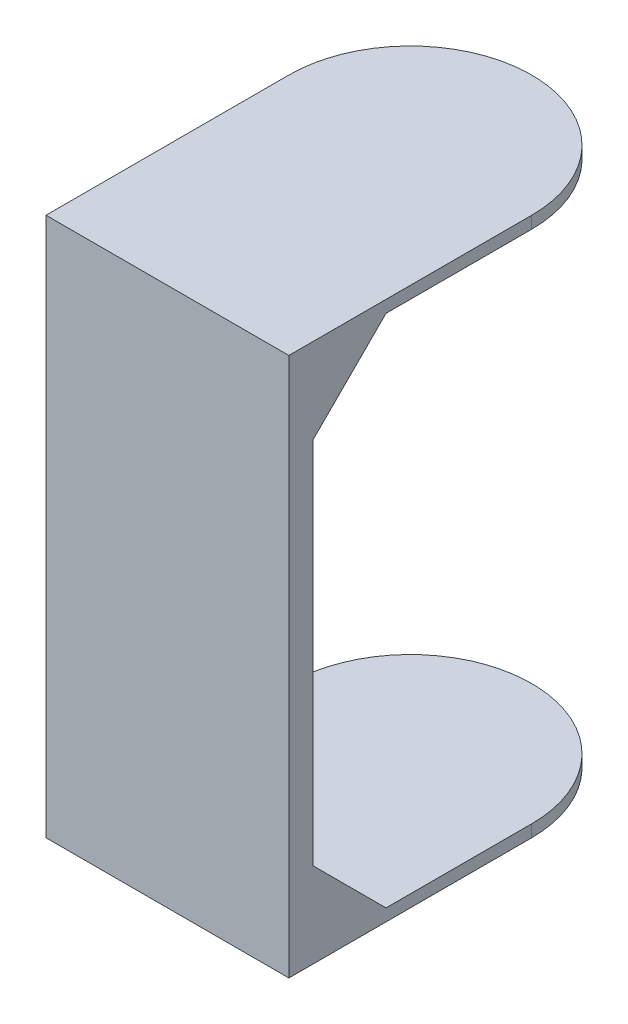
ISO-10303-21;
HEADER;
FILE_DESCRIPTION(('STEP AP214'),'2;1');
FILE_NAME('part.step','',(''),(''),'','','');
FILE_SCHEMA(('AUTOMOTIVE_DESIGN { 1 0 10303 214 1 1 1 1 }'));
ENDSEC;
DATA;
#1=APPLICATION_CONTEXT('core data for automotive mechanical design processes');
#2=APPLICATION_PROTOCOL_DEFINITION('international standard','automotive_design',2000,#1);
#3=PRODUCT_CONTEXT('',#1,'mechanical');
#4=PRODUCT('Part','Part','',(#3));
#5=PRODUCT_RELATED_PRODUCT_CATEGORY('part','',(#4));
#6=PRODUCT_DEFINITION_FORMATION('','',#4);
#7=PRODUCT_DEFINITION_CONTEXT('part definition',#1,'design');
#8=PRODUCT_DEFINITION('design','',#6,#7);
#9=PRODUCT_DEFINITION_SHAPE('','',#8);
#10=(LENGTH_UNIT() NAMED_UNIT(*) SI_UNIT(.MILLI.,.METRE.));
#11=(NAMED_UNIT(*) PLANE_ANGLE_UNIT() SI_UNIT($,.RADIAN.));
#12=(NAMED_UNIT(*) SI_UNIT($,.STERADIAN.) SOLID_ANGLE_UNIT());
#13=UNCERTAINTY_MEASURE_WITH_UNIT(LENGTH_MEASURE(1.E-05),#10,'distance_accuracy_value','');
#14=(GEOMETRIC_REPRESENTATION_CONTEXT(3) GLOBAL_UNCERTAINTY_ASSIGNED_CONTEXT((#13)) GLOBAL_UNIT_ASSIGNED_CONTEXT((#10,
#11,#12)) REPRESENTATION_CONTEXT('',''));
#15=CARTESIAN_POINT('',(0.,0.,0.));
#16=DIRECTION('',(0.,0.,1.));
#17=DIRECTION('',(1.,0.,0.));
#18=AXIS2_PLACEMENT_3D('',#15,#16,#17);
#19=CARTESIAN_POINT('',(0.,0.,-10.));
#20=DIRECTION('',(0.,0.,1.));
#21=DIRECTION('',(1.,0.,0.));
#22=AXIS2_PLACEMENT_3D('',#19,#20,#21);
#23=PLANE('',#22);
#24=DIRECTION('',(0.,1.,0.));
#25=VECTOR('',#24,1.);
#26=CARTESIAN_POINT('',(-40.,-106.,-10.));
#27=LINE('',#26,#25);
#28=CARTESIAN_POINT('',(-40.,-106.,-10.));
#29=VERTEX_POINT('',#28);
#30=CARTESIAN_POINT('',(-40.,-76.,-10.));
#31=VERTEX_POINT('',#30);
#32=EDGE_CURVE('E195',#29,#31,#27,.T.);
#33=ORIENTED_EDGE('',*,*,#32,.T.);
#34=DIRECTION('',(-1.,0.,0.));
#35=VECTOR('',#34,1.);
#36=CARTESIAN_POINT('',(-40.,-76.,-10.));
#37=LINE('',#36,#35);
#38=CARTESIAN_POINT('',(-50.,-76.,-10.));
#39=VERTEX_POINT('',#38);
#40=EDGE_CURVE('E203',#31,#39,#37,.T.);
#41=ORIENTED_EDGE('',*,*,#40,.T.);
#42=DIRECTION('',(0.,-1.,0.));
#43=VECTOR('',#42,1.);
#44=CARTESIAN_POINT('',(-50.,106.,-10.));
#45=LINE('',#44,#43);
#46=CARTESIAN_POINT('',(-50.,106.,-10.));
#47=VERTEX_POINT('',#46);
#48=EDGE_CURVE('E41',#47,#39,#45,.T.);
#49=ORIENTED_EDGE('',*,*,#48,.F.);
#50=DIRECTION('',(-1.,0.,0.));
#51=VECTOR('',#50,1.);
#52=CARTESIAN_POINT('',(-50.,106.,-10.));
#53=LINE('',#52,#51);
#54=CARTESIAN_POINT('',(40.,106.,-10.));
#55=VERTEX_POINT('',#54);
#56=EDGE_CURVE('E239',#55,#47,#53,.T.);
#57=ORIENTED_EDGE('',*,*,#56,.F.);
#58=DIRECTION('',(0.,-1.,0.));
#59=VECTOR('',#58,1.);
#60=CARTESIAN_POINT('',(40.,106.,-10.));
#61=LINE('',#60,#59);
#62=CARTESIAN_POINT('',(40.,76.,-10.));
#63=VERTEX_POINT('',#62);
#64=EDGE_CURVE('E226',#55,#63,#61,.T.);
#65=ORIENTED_EDGE('',*,*,#64,.T.);
#66=DIRECTION('',(1.,0.,0.));
#67=VECTOR('',#66,1.);
#68=CARTESIAN_POINT('',(40.,76.,-10.));
#69=LINE('',#68,#67);
#70=CARTESIAN_POINT('',(50.,76.,-10.));
#71=VERTEX_POINT('',#70);
#72=EDGE_CURVE('E232',#63,#71,#69,.T.);
#73=ORIENTED_EDGE('',*,*,#72,.T.);
#74=DIRECTION('',(0.,1.,0.));
#75=VECTOR('',#74,1.);
#76=CARTESIAN_POINT('',(50.,106.,-10.));
#77=LINE('',#76,#75);
#78=CARTESIAN_POINT('',(50.,-76.,-10.));
#79=VERTEX_POINT('',#78);
#80=EDGE_CURVE('E54',#79,#71,#77,.T.);
#81=ORIENTED_EDGE('',*,*,#80,.F.);
#82=DIRECTION('',(1.,0.,0.));
#83=VECTOR('',#82,1.);
#84=CARTESIAN_POINT('',(40.,-76.,-10.));
#85=LINE('',#84,#83);
#86=CARTESIAN_POINT('',(40.,-76.,-10.));
#87=VERTEX_POINT('',#86);
#88=EDGE_CURVE('E218',#87,#79,#85,.T.);
#89=ORIENTED_EDGE('',*,*,#88,.F.);
#90=DIRECTION('',(0.,1.,0.));
#91=VECTOR('',#90,1.);
#92=CARTESIAN_POINT('',(40.,-106.,-10.));
#93=LINE('',#92,#91);
#94=CARTESIAN_POINT('',(40.,-106.,-10.));
#95=VERTEX_POINT('',#94);
#96=EDGE_CURVE('E214',#95,#87,#93,.T.);
#97=ORIENTED_EDGE('',*,*,#96,.F.);
#98=DIRECTION('',(1.,0.,0.));
#99=VECTOR('',#98,1.);
#100=CARTESIAN_POINT('',(-50.,-106.,-10.));
#101=LINE('',#100,#99);
#102=EDGE_CURVE('E11',#29,#95,#101,.T.);
#103=ORIENTED_EDGE('',*,*,#102,.F.);
#104=EDGE_LOOP('',(#33,#41,#49,#57,#65,#73,#81,#89,#97,#103));
#105=FACE_BOUND('',#104,.T.);
#106=ADVANCED_FACE('F32',(#105),#23,.F.);
#107=CARTESIAN_POINT('',(50.,106.,-10.));
#108=DIRECTION('',(1.,0.,0.));
#109=DIRECTION('',(0.,1.,0.));
#110=AXIS2_PLACEMENT_3D('',#107,#108,#109);
#111=PLANE('',#110);
#112=DIRECTION('',(0.,1.,0.));
#113=VECTOR('',#112,1.);
#114=CARTESIAN_POINT('',(50.,106.,0.));
#115=LINE('',#114,#113);
#116=CARTESIAN_POINT('',(50.,-111.,0.));
#117=VERTEX_POINT('',#116);
#118=CARTESIAN_POINT('',(50.,111.,0.));
#119=VERTEX_POINT('',#118);
#120=EDGE_CURVE('E158',#117,#119,#115,.T.);
#121=ORIENTED_EDGE('',*,*,#120,.F.);
#122=DIRECTION('',(0.,0.,-1.));
#123=VECTOR('',#122,1.);
#124=CARTESIAN_POINT('',(50.,-111.,0.));
#125=LINE('',#124,#123);
#126=CARTESIAN_POINT('',(50.,-111.,-100.));
#127=VERTEX_POINT('',#126);
#128=EDGE_CURVE('E151',#117,#127,#125,.T.);
#129=ORIENTED_EDGE('',*,*,#128,.T.);
#130=DIRECTION('',(0.,1.,0.));
#131=VECTOR('',#130,1.);
#132=CARTESIAN_POINT('',(50.,-111.,-100.));
#133=LINE('',#132,#131);
#134=CARTESIAN_POINT('',(50.,-106.,-100.));
#135=VERTEX_POINT('',#134);
#136=EDGE_CURVE('E136',#127,#135,#133,.T.);
#137=ORIENTED_EDGE('',*,*,#136,.T.);
#138=DIRECTION('',(0.,0.,-1.));
#139=VECTOR('',#138,1.);
#140=CARTESIAN_POINT('',(50.,-106.,0.));
#141=LINE('',#140,#139);
#142=CARTESIAN_POINT('',(50.,-106.,-40.));
#143=VERTEX_POINT('',#142);
#144=EDGE_CURVE('E165',#143,#135,#141,.T.);
#145=ORIENTED_EDGE('',*,*,#144,.F.);
#146=DIRECTION('',(0.,-0.707106781186548,-0.707106781186547));
#147=VECTOR('',#146,1.);
#148=CARTESIAN_POINT('',(50.,-76.,-10.));
#149=LINE('',#148,#147);
#150=EDGE_CURVE('E49',#79,#143,#149,.T.);
#151=ORIENTED_EDGE('',*,*,#150,.F.);
#152=ORIENTED_EDGE('',*,*,#80,.T.);
#153=DIRECTION('',(0.,0.707106781186548,-0.707106781186547));
#154=VECTOR('',#153,1.);
#155=CARTESIAN_POINT('',(50.,76.,-10.));
#156=LINE('',#155,#154);
#157=CARTESIAN_POINT('',(50.,106.,-40.));
#158=VERTEX_POINT('',#157);
#159=EDGE_CURVE('E220',#71,#158,#156,.T.);
#160=ORIENTED_EDGE('',*,*,#159,.T.);
#161=DIRECTION('',(0.,0.,-1.));
#162=VECTOR('',#161,1.);
#163=CARTESIAN_POINT('',(50.,106.,0.));
#164=LINE('',#163,#162);
#165=CARTESIAN_POINT('',(50.,106.,-100.));
#166=VERTEX_POINT('',#165);
#167=EDGE_CURVE('E174',#158,#166,#164,.T.);
#168=ORIENTED_EDGE('',*,*,#167,.T.);
#169=DIRECTION('',(0.,-1.,0.));
#170=VECTOR('',#169,1.);
#171=CARTESIAN_POINT('',(50.,111.,-100.));
#172=LINE('',#171,#170);
#173=CARTESIAN_POINT('',(50.,111.,-100.));
#174=VERTEX_POINT('',#173);
#175=EDGE_CURVE('E182',#174,#166,#172,.T.);
#176=ORIENTED_EDGE('',*,*,#175,.F.);
#177=DIRECTION('',(0.,0.,-1.));
#178=VECTOR('',#177,1.);
#179=CARTESIAN_POINT('',(50.,111.,0.));
#180=LINE('',#179,#178);
#181=EDGE_CURVE('E180',#119,#174,#180,.T.);
#182=ORIENTED_EDGE('',*,*,#181,.F.);
#183=EDGE_LOOP('',(#121,#129,#137,#145,#151,#152,#160,#168,#176,#182));
#184=FACE_BOUND('',#183,.T.);
#185=ADVANCED_FACE('F34',(#184),#111,.T.);
#186=CARTESIAN_POINT('',(-50.,106.,-10.));
#187=DIRECTION('',(-1.,0.,0.));
#188=DIRECTION('',(0.,-1.,0.));
#189=AXIS2_PLACEMENT_3D('',#186,#187,#188);
#190=PLANE('',#189);
#191=DIRECTION('',(0.,-1.,0.));
#192=VECTOR('',#191,1.);
#193=CARTESIAN_POINT('',(-50.,106.,0.));
#194=LINE('',#193,#192);
#195=CARTESIAN_POINT('',(-50.,111.,0.));
#196=VERTEX_POINT('',#195);
#197=CARTESIAN_POINT('',(-50.,-111.,0.));
#198=VERTEX_POINT('',#197);
#199=EDGE_CURVE('E36',#196,#198,#194,.T.);
#200=ORIENTED_EDGE('',*,*,#199,.F.);
#201=DIRECTION('',(0.,0.,1.));
#202=VECTOR('',#201,1.);
#203=CARTESIAN_POINT('',(-50.,111.,0.));
#204=LINE('',#203,#202);
#205=CARTESIAN_POINT('',(-50.,111.,-100.));
#206=VERTEX_POINT('',#205);
#207=EDGE_CURVE('E173',#206,#196,#204,.T.);
#208=ORIENTED_EDGE('',*,*,#207,.F.);
#209=DIRECTION('',(0.,-1.,0.));
#210=VECTOR('',#209,1.);
#211=CARTESIAN_POINT('',(-50.,111.,-100.));
#212=LINE('',#211,#210);
#213=CARTESIAN_POINT('',(-50.,106.,-100.));
#214=VERTEX_POINT('',#213);
#215=EDGE_CURVE('E191',#206,#214,#212,.T.);
#216=ORIENTED_EDGE('',*,*,#215,.T.);
#217=DIRECTION('',(0.,0.,1.));
#218=VECTOR('',#217,1.);
#219=CARTESIAN_POINT('',(-50.,106.,0.));
#220=LINE('',#219,#218);
#221=EDGE_CURVE('E185',#214,#47,#220,.T.);
#222=ORIENTED_EDGE('',*,*,#221,.T.);
#223=ORIENTED_EDGE('',*,*,#48,.T.);
#224=DIRECTION('',(0.,-0.707106781186548,-0.707106781186547));
#225=VECTOR('',#224,1.);
#226=CARTESIAN_POINT('',(-50.,-76.,-10.));
#227=LINE('',#226,#225);
#228=CARTESIAN_POINT('',(-50.,-106.,-40.));
#229=VERTEX_POINT('',#228);
#230=EDGE_CURVE('E194',#39,#229,#227,.T.);
#231=ORIENTED_EDGE('',*,*,#230,.T.);
#232=DIRECTION('',(0.,0.,1.));
#233=VECTOR('',#232,1.);
#234=CARTESIAN_POINT('',(-50.,-106.,0.));
#235=LINE('',#234,#233);
#236=CARTESIAN_POINT('',(-50.,-106.,-100.));
#237=VERTEX_POINT('',#236);
#238=EDGE_CURVE('E155',#237,#229,#235,.T.);
#239=ORIENTED_EDGE('',*,*,#238,.F.);
#240=DIRECTION('',(0.,1.,0.));
#241=VECTOR('',#240,1.);
#242=CARTESIAN_POINT('',(-50.,-111.,-100.));
#243=LINE('',#242,#241);
#244=CARTESIAN_POINT('',(-50.,-111.,-100.));
#245=VERTEX_POINT('',#244);
#246=EDGE_CURVE('E145',#245,#237,#243,.T.);
#247=ORIENTED_EDGE('',*,*,#246,.F.);
#248=DIRECTION('',(0.,0.,1.));
#249=VECTOR('',#248,1.);
#250=CARTESIAN_POINT('',(-50.,-111.,0.));
#251=LINE('',#250,#249);
#252=EDGE_CURVE('E154',#245,#198,#251,.T.);
#253=ORIENTED_EDGE('',*,*,#252,.T.);
#254=EDGE_LOOP('',(#200,#208,#216,#222,#223,#231,#239,#247,#253));
#255=FACE_BOUND('',#254,.T.);
#256=ADVANCED_FACE('F247',(#255),#190,.T.);
#257=CARTESIAN_POINT('',(0.,0.,0.));
#258=DIRECTION('',(0.,0.,1.));
#259=DIRECTION('',(1.,0.,0.));
#260=AXIS2_PLACEMENT_3D('',#257,#258,#259);
#261=PLANE('',#260);
#262=ORIENTED_EDGE('',*,*,#120,.T.);
#263=DIRECTION('',(1.,0.,0.));
#264=VECTOR('',#263,1.);
#265=CARTESIAN_POINT('',(-50.,111.,0.));
#266=LINE('',#265,#264);
#267=EDGE_CURVE('E177',#196,#119,#266,.T.);
#268=ORIENTED_EDGE('',*,*,#267,.F.);
#269=ORIENTED_EDGE('',*,*,#199,.T.);
#270=DIRECTION('',(1.,0.,0.));
#271=VECTOR('',#270,1.);
#272=CARTESIAN_POINT('',(-50.,-111.,0.));
#273=LINE('',#272,#271);
#274=EDGE_CURVE('E159',#198,#117,#273,.T.);
#275=ORIENTED_EDGE('',*,*,#274,.T.);
#276=EDGE_LOOP('',(#262,#268,#269,#275));
#277=FACE_BOUND('',#276,.T.);
#278=ADVANCED_FACE('F245',(#277),#261,.T.);
#279=CARTESIAN_POINT('',(40.,76.,-10.));
#280=DIRECTION('',(0.,-0.707106781186547,-0.707106781186548));
#281=DIRECTION('',(0.,0.707106781186548,-0.707106781186547));
#282=AXIS2_PLACEMENT_3D('',#279,#280,#281);
#283=PLANE('',#282);
#284=ORIENTED_EDGE('',*,*,#159,.F.);
#285=ORIENTED_EDGE('',*,*,#72,.F.);
#286=DIRECTION('',(0.,0.707106781186548,-0.707106781186547));
#287=VECTOR('',#286,1.);
#288=CARTESIAN_POINT('',(40.,76.,-10.));
#289=LINE('',#288,#287);
#290=CARTESIAN_POINT('',(40.,106.,-40.));
#291=VERTEX_POINT('',#290);
#292=EDGE_CURVE('E229',#63,#291,#289,.T.);
#293=ORIENTED_EDGE('',*,*,#292,.T.);
#294=DIRECTION('',(1.,0.,0.));
#295=VECTOR('',#294,1.);
#296=CARTESIAN_POINT('',(40.,106.,-40.));
#297=LINE('',#296,#295);
#298=EDGE_CURVE('E234',#291,#158,#297,.T.);
#299=ORIENTED_EDGE('',*,*,#298,.T.);
#300=EDGE_LOOP('',(#284,#285,#293,#299));
#301=FACE_BOUND('',#300,.T.);
#302=ADVANCED_FACE('F263',(#301),#283,.T.);
#303=CARTESIAN_POINT('',(40.,0.,0.));
#304=DIRECTION('',(1.,0.,0.));
#305=DIRECTION('',(0.,0.,-1.));
#306=AXIS2_PLACEMENT_3D('',#303,#304,#305);
#307=PLANE('',#306);
#308=DIRECTION('',(0.,0.,1.));
#309=VECTOR('',#308,1.);
#310=CARTESIAN_POINT('',(40.,106.,-40.));
#311=LINE('',#310,#309);
#312=EDGE_CURVE('E223',#291,#55,#311,.T.);
#313=ORIENTED_EDGE('',*,*,#312,.F.);
#314=ORIENTED_EDGE('',*,*,#292,.F.);
#315=ORIENTED_EDGE('',*,*,#64,.F.);
#316=EDGE_LOOP('',(#313,#314,#315));
#317=FACE_BOUND('',#316,.T.);
#318=ADVANCED_FACE('F266',(#317),#307,.F.);
#319=CARTESIAN_POINT('',(40.,-76.,-10.));
#320=DIRECTION('',(0.,-0.707106781186547,0.707106781186548));
#321=DIRECTION('',(0.,-0.707106781186548,-0.707106781186547));
#322=AXIS2_PLACEMENT_3D('',#319,#320,#321);
#323=PLANE('',#322);
#324=ORIENTED_EDGE('',*,*,#150,.T.);
#325=DIRECTION('',(1.,0.,0.));
#326=VECTOR('',#325,1.);
#327=CARTESIAN_POINT('',(40.,-106.,-40.));
#328=LINE('',#327,#326);
#329=CARTESIAN_POINT('',(40.,-106.,-40.));
#330=VERTEX_POINT('',#329);
#331=EDGE_CURVE('E216',#330,#143,#328,.T.);
#332=ORIENTED_EDGE('',*,*,#331,.F.);
#333=DIRECTION('',(0.,-0.707106781186548,-0.707106781186547));
#334=VECTOR('',#333,1.);
#335=CARTESIAN_POINT('',(40.,-76.,-10.));
#336=LINE('',#335,#334);
#337=EDGE_CURVE('E212',#87,#330,#336,.T.);
#338=ORIENTED_EDGE('',*,*,#337,.F.);
#339=ORIENTED_EDGE('',*,*,#88,.T.);
#340=EDGE_LOOP('',(#324,#332,#338,#339));
#341=FACE_BOUND('',#340,.T.);
#342=ADVANCED_FACE('F256',(#341),#323,.F.);
#343=CARTESIAN_POINT('',(40.,0.,0.));
#344=DIRECTION('',(1.,0.,0.));
#345=DIRECTION('',(0.,0.,-1.));
#346=AXIS2_PLACEMENT_3D('',#343,#344,#345);
#347=PLANE('',#346);
#348=DIRECTION('',(0.,0.,1.));
#349=VECTOR('',#348,1.);
#350=CARTESIAN_POINT('',(40.,-106.,-40.));
#351=LINE('',#350,#349);
#352=EDGE_CURVE('E210',#330,#95,#351,.T.);
#353=ORIENTED_EDGE('',*,*,#352,.T.);
#354=ORIENTED_EDGE('',*,*,#96,.T.);
#355=ORIENTED_EDGE('',*,*,#337,.T.);
#356=EDGE_LOOP('',(#353,#354,#355));
#357=FACE_BOUND('',#356,.T.);
#358=ADVANCED_FACE('F323',(#357),#347,.F.);
#359=CARTESIAN_POINT('',(-40.,-76.,-10.));
#360=DIRECTION('',(0.,0.707106781186547,-0.707106781186548));
#361=DIRECTION('',(0.,0.707106781186548,0.707106781186547));
#362=AXIS2_PLACEMENT_3D('',#359,#360,#361);
#363=PLANE('',#362);
#364=ORIENTED_EDGE('',*,*,#230,.F.);
#365=ORIENTED_EDGE('',*,*,#40,.F.);
#366=DIRECTION('',(0.,-0.707106781186548,-0.707106781186547));
#367=VECTOR('',#366,1.);
#368=CARTESIAN_POINT('',(-40.,-76.,-10.));
#369=LINE('',#368,#367);
#370=CARTESIAN_POINT('',(-40.,-106.,-40.));
#371=VERTEX_POINT('',#370);
#372=EDGE_CURVE('E198',#31,#371,#369,.T.);
#373=ORIENTED_EDGE('',*,*,#372,.T.);
#374=DIRECTION('',(-1.,0.,0.));
#375=VECTOR('',#374,1.);
#376=CARTESIAN_POINT('',(-40.,-106.,-40.));
#377=LINE('',#376,#375);
#378=EDGE_CURVE('E206',#371,#229,#377,.T.);
#379=ORIENTED_EDGE('',*,*,#378,.T.);
#380=EDGE_LOOP('',(#364,#365,#373,#379));
#381=FACE_BOUND('',#380,.T.);
#382=ADVANCED_FACE('F330',(#381),#363,.T.);
#383=CARTESIAN_POINT('',(-40.,0.,0.));
#384=DIRECTION('',(1.,0.,0.));
#385=DIRECTION('',(0.,1.,0.));
#386=AXIS2_PLACEMENT_3D('',#383,#384,#385);
#387=PLANE('',#386);
#388=ORIENTED_EDGE('',*,*,#32,.F.);
#389=DIRECTION('',(0.,0.,1.));
#390=VECTOR('',#389,1.);
#391=CARTESIAN_POINT('',(-40.,-106.,-40.));
#392=LINE('',#391,#390);
#393=EDGE_CURVE('E200',#371,#29,#392,.T.);
#394=ORIENTED_EDGE('',*,*,#393,.F.);
#395=ORIENTED_EDGE('',*,*,#372,.F.);
#396=EDGE_LOOP('',(#388,#394,#395));
#397=FACE_BOUND('',#396,.T.);
#398=ADVANCED_FACE('F285',(#397),#387,.T.);
#399=CARTESIAN_POINT('',(0.,111.,-100.));
#400=DIRECTION('',(0.,-1.,0.));
#401=DIRECTION('',(0.,0.,-1.));
#402=AXIS2_PLACEMENT_3D('',#399,#400,#401);
#403=CYLINDRICAL_SURFACE('',#402,50.);
#404=CARTESIAN_POINT('',(0.,106.,-100.));
#405=DIRECTION('',(0.,1.,0.));
#406=DIRECTION('',(0.,0.,1.));
#407=AXIS2_PLACEMENT_3D('',#404,#405,#406);
#408=CIRCLE('',#407,50.);
#409=EDGE_CURVE('E144',#166,#214,#408,.T.);
#410=ORIENTED_EDGE('',*,*,#409,.T.);
#411=ORIENTED_EDGE('',*,*,#215,.F.);
#412=CARTESIAN_POINT('',(0.,111.,-100.));
#413=DIRECTION('',(0.,1.,0.));
#414=DIRECTION('',(0.,0.,1.));
#415=AXIS2_PLACEMENT_3D('',#412,#413,#414);
#416=CIRCLE('',#415,50.);
#417=EDGE_CURVE('E170',#174,#206,#416,.T.);
#418=ORIENTED_EDGE('',*,*,#417,.F.);
#419=ORIENTED_EDGE('',*,*,#175,.T.);
#420=EDGE_LOOP('',(#410,#411,#418,#419));
#421=FACE_BOUND('',#420,.T.);
#422=ADVANCED_FACE('F274',(#421),#403,.T.);
#423=CARTESIAN_POINT('',(0.,111.,-100.));
#424=DIRECTION('',(0.,1.,0.));
#425=DIRECTION('',(0.,0.,1.));
#426=AXIS2_PLACEMENT_3D('',#423,#424,#425);
#427=PLANE('',#426);
#428=ORIENTED_EDGE('',*,*,#417,.T.);
#429=ORIENTED_EDGE('',*,*,#207,.T.);
#430=ORIENTED_EDGE('',*,*,#267,.T.);
#431=ORIENTED_EDGE('',*,*,#181,.T.);
#432=EDGE_LOOP('',(#428,#429,#430,#431));
#433=FACE_BOUND('',#432,.T.);
#434=ADVANCED_FACE('F277',(#433),#427,.T.);
#435=CARTESIAN_POINT('',(0.,106.,-100.));
#436=DIRECTION('',(0.,1.,0.));
#437=DIRECTION('',(0.,0.,1.));
#438=AXIS2_PLACEMENT_3D('',#435,#436,#437);
#439=PLANE('',#438);
#440=ORIENTED_EDGE('',*,*,#298,.F.);
#441=ORIENTED_EDGE('',*,*,#312,.T.);
#442=ORIENTED_EDGE('',*,*,#56,.T.);
#443=ORIENTED_EDGE('',*,*,#221,.F.);
#444=ORIENTED_EDGE('',*,*,#409,.F.);
#445=ORIENTED_EDGE('',*,*,#167,.F.);
#446=EDGE_LOOP('',(#440,#441,#442,#443,#444,#445));
#447=FACE_BOUND('',#446,.T.);
#448=ADVANCED_FACE('F268',(#447),#439,.F.);
#449=CARTESIAN_POINT('',(0.,-111.,-100.));
#450=DIRECTION('',(0.,1.,0.));
#451=DIRECTION('',(0.,0.,1.));
#452=AXIS2_PLACEMENT_3D('',#449,#450,#451);
#453=CYLINDRICAL_SURFACE('',#452,50.);
#454=CARTESIAN_POINT('',(0.,-106.,-100.));
#455=DIRECTION('',(0.,1.,0.));
#456=DIRECTION('',(0.,0.,1.));
#457=AXIS2_PLACEMENT_3D('',#454,#455,#456);
#458=CIRCLE('',#457,50.);
#459=EDGE_CURVE('E142',#135,#237,#458,.T.);
#460=ORIENTED_EDGE('',*,*,#459,.F.);
#461=ORIENTED_EDGE('',*,*,#136,.F.);
#462=CARTESIAN_POINT('',(0.,-111.,-100.));
#463=DIRECTION('',(0.,1.,0.));
#464=DIRECTION('',(0.,0.,1.));
#465=AXIS2_PLACEMENT_3D('',#462,#463,#464);
#466=CIRCLE('',#465,50.);
#467=EDGE_CURVE('E139',#127,#245,#466,.T.);
#468=ORIENTED_EDGE('',*,*,#467,.T.);
#469=ORIENTED_EDGE('',*,*,#246,.T.);
#470=EDGE_LOOP('',(#460,#461,#468,#469));
#471=FACE_BOUND('',#470,.T.);
#472=ADVANCED_FACE('F138',(#471),#453,.T.);
#473=CARTESIAN_POINT('',(0.,-111.,-100.));
#474=DIRECTION('',(0.,-1.,0.));
#475=DIRECTION('',(0.,0.,1.));
#476=AXIS2_PLACEMENT_3D('',#473,#474,#475);
#477=PLANE('',#476);
#478=ORIENTED_EDGE('',*,*,#467,.F.);
#479=ORIENTED_EDGE('',*,*,#128,.F.);
#480=ORIENTED_EDGE('',*,*,#274,.F.);
#481=ORIENTED_EDGE('',*,*,#252,.F.);
#482=EDGE_LOOP('',(#478,#479,#480,#481));
#483=FACE_BOUND('',#482,.T.);
#484=ADVANCED_FACE('F149',(#483),#477,.T.);
#485=CARTESIAN_POINT('',(0.,-106.,-100.));
#486=DIRECTION('',(0.,-1.,0.));
#487=DIRECTION('',(0.,0.,1.));
#488=AXIS2_PLACEMENT_3D('',#485,#486,#487);
#489=PLANE('',#488);
#490=ORIENTED_EDGE('',*,*,#378,.F.);
#491=ORIENTED_EDGE('',*,*,#393,.T.);
#492=ORIENTED_EDGE('',*,*,#102,.T.);
#493=ORIENTED_EDGE('',*,*,#352,.F.);
#494=ORIENTED_EDGE('',*,*,#331,.T.);
#495=ORIENTED_EDGE('',*,*,#144,.T.);
#496=ORIENTED_EDGE('',*,*,#459,.T.);
#497=ORIENTED_EDGE('',*,*,#238,.T.);
#498=EDGE_LOOP('',(#490,#491,#492,#493,#494,#495,#496,#497));
#499=FACE_BOUND('',#498,.T.);
#500=ADVANCED_FACE('F251',(#499),#489,.F.);
#501=CLOSED_SHELL('',(#106,#185,#256,#278,#302,#318,#342,#358,#382,#398,#422,#434,#448,#472,
#484,#500));
#502=MANIFOLD_SOLID_BREP('B2',#501);
#503=ADVANCED_BREP_SHAPE_REPRESENTATION('',(#18,#502),#14);
#504=SHAPE_DEFINITION_REPRESENTATION(#9,#503);
ENDSEC;
END-ISO-10303-21;
